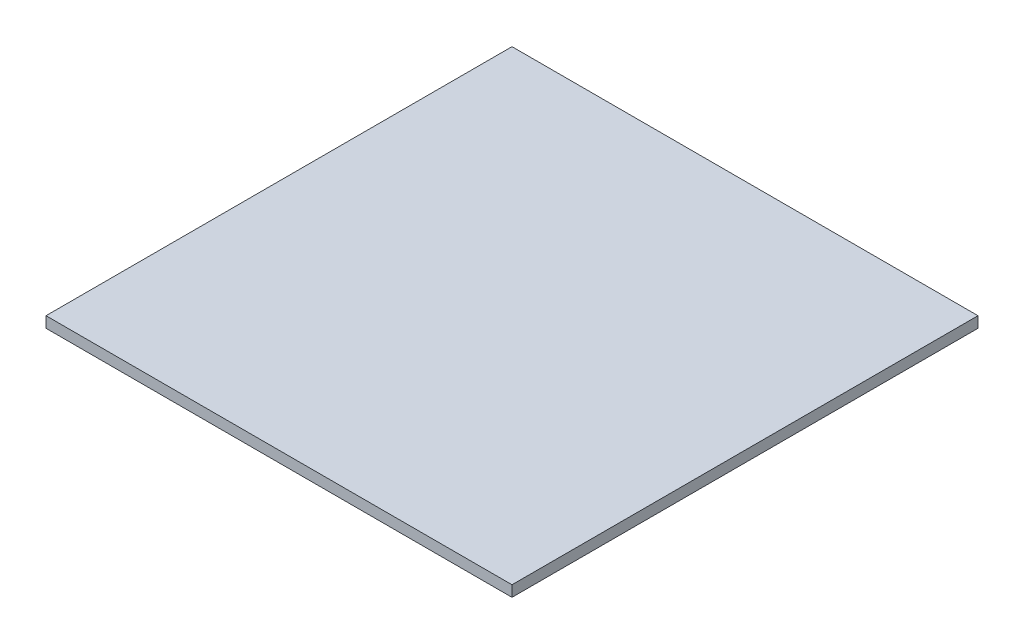
ISO-10303-21;
HEADER;
FILE_DESCRIPTION(('STEP AP214'),'2;1');
FILE_NAME('part.step','',(''),(''),'','','');
FILE_SCHEMA(('AUTOMOTIVE_DESIGN { 1 0 10303 214 1 1 1 1 }'));
ENDSEC;
DATA;
#1=APPLICATION_CONTEXT('core data for automotive mechanical design processes');
#2=APPLICATION_PROTOCOL_DEFINITION('international standard','automotive_design',2000,#1);
#3=PRODUCT_CONTEXT('',#1,'mechanical');
#4=PRODUCT('Part','Part','',(#3));
#5=PRODUCT_RELATED_PRODUCT_CATEGORY('part','',(#4));
#6=PRODUCT_DEFINITION_FORMATION('','',#4);
#7=PRODUCT_DEFINITION_CONTEXT('part definition',#1,'design');
#8=PRODUCT_DEFINITION('design','',#6,#7);
#9=PRODUCT_DEFINITION_SHAPE('','',#8);
#10=(LENGTH_UNIT() NAMED_UNIT(*) SI_UNIT(.MILLI.,.METRE.));
#11=(NAMED_UNIT(*) PLANE_ANGLE_UNIT() SI_UNIT($,.RADIAN.));
#12=(NAMED_UNIT(*) SI_UNIT($,.STERADIAN.) SOLID_ANGLE_UNIT());
#13=UNCERTAINTY_MEASURE_WITH_UNIT(LENGTH_MEASURE(1.E-05),#10,'distance_accuracy_value','');
#14=(GEOMETRIC_REPRESENTATION_CONTEXT(3) GLOBAL_UNCERTAINTY_ASSIGNED_CONTEXT((#13)) GLOBAL_UNIT_ASSIGNED_CONTEXT((#10,
#11,#12)) REPRESENTATION_CONTEXT('',''));
#15=CARTESIAN_POINT('',(0.,0.,0.));
#16=DIRECTION('',(0.,0.,1.));
#17=DIRECTION('',(1.,0.,0.));
#18=AXIS2_PLACEMENT_3D('',#15,#16,#17);
#19=CARTESIAN_POINT('',(0.,19.05,0.));
#20=DIRECTION('',(1.,0.,0.));
#21=DIRECTION('',(0.,0.,-1.));
#22=AXIS2_PLACEMENT_3D('',#19,#20,#21);
#23=PLANE('',#22);
#24=DIRECTION('',(0.,0.,1.));
#25=VECTOR('',#24,1.);
#26=CARTESIAN_POINT('',(0.,0.,0.));
#27=LINE('',#26,#25);
#28=CARTESIAN_POINT('',(0.,0.,-812.8));
#29=VERTEX_POINT('',#28);
#30=CARTESIAN_POINT('',(0.,0.,0.));
#31=VERTEX_POINT('',#30);
#32=EDGE_CURVE('E95',#29,#31,#27,.T.);
#33=ORIENTED_EDGE('',*,*,#32,.T.);
#34=DIRECTION('',(0.,-1.,0.));
#35=VECTOR('',#34,1.);
#36=CARTESIAN_POINT('',(0.,19.05,0.));
#37=LINE('',#36,#35);
#38=CARTESIAN_POINT('',(0.,19.05,0.));
#39=VERTEX_POINT('',#38);
#40=EDGE_CURVE('E11',#39,#31,#37,.T.);
#41=ORIENTED_EDGE('',*,*,#40,.F.);
#42=DIRECTION('',(0.,0.,1.));
#43=VECTOR('',#42,1.);
#44=CARTESIAN_POINT('',(0.,19.05,0.));
#45=LINE('',#44,#43);
#46=CARTESIAN_POINT('',(0.,19.05,-812.8));
#47=VERTEX_POINT('',#46);
#48=EDGE_CURVE('E83',#47,#39,#45,.T.);
#49=ORIENTED_EDGE('',*,*,#48,.F.);
#50=DIRECTION('',(0.,-1.,0.));
#51=VECTOR('',#50,1.);
#52=CARTESIAN_POINT('',(0.,19.05,-812.8));
#53=LINE('',#52,#51);
#54=EDGE_CURVE('E91',#47,#29,#53,.T.);
#55=ORIENTED_EDGE('',*,*,#54,.T.);
#56=EDGE_LOOP('',(#33,#41,#49,#55));
#57=FACE_BOUND('',#56,.T.);
#58=ADVANCED_FACE('F32',(#57),#23,.F.);
#59=CARTESIAN_POINT('',(0.,19.05,0.));
#60=DIRECTION('',(0.,0.,-1.));
#61=DIRECTION('',(-1.,0.,0.));
#62=AXIS2_PLACEMENT_3D('',#59,#60,#61);
#63=PLANE('',#62);
#64=DIRECTION('',(1.,0.,0.));
#65=VECTOR('',#64,1.);
#66=CARTESIAN_POINT('',(0.,0.,0.));
#67=LINE('',#66,#65);
#68=CARTESIAN_POINT('',(812.8,0.,0.));
#69=VERTEX_POINT('',#68);
#70=EDGE_CURVE('E87',#31,#69,#67,.T.);
#71=ORIENTED_EDGE('',*,*,#70,.T.);
#72=DIRECTION('',(0.,-1.,0.));
#73=VECTOR('',#72,1.);
#74=CARTESIAN_POINT('',(812.8,19.05,0.));
#75=LINE('',#74,#73);
#76=CARTESIAN_POINT('',(812.8,19.05,0.));
#77=VERTEX_POINT('',#76);
#78=EDGE_CURVE('E40',#77,#69,#75,.T.);
#79=ORIENTED_EDGE('',*,*,#78,.F.);
#80=DIRECTION('',(1.,0.,0.));
#81=VECTOR('',#80,1.);
#82=CARTESIAN_POINT('',(0.,19.05,0.));
#83=LINE('',#82,#81);
#84=EDGE_CURVE('E78',#39,#77,#83,.T.);
#85=ORIENTED_EDGE('',*,*,#84,.F.);
#86=ORIENTED_EDGE('',*,*,#40,.T.);
#87=EDGE_LOOP('',(#71,#79,#85,#86));
#88=FACE_BOUND('',#87,.T.);
#89=ADVANCED_FACE('F86',(#88),#63,.F.);
#90=CARTESIAN_POINT('',(812.8,19.05,0.));
#91=DIRECTION('',(-1.,0.,0.));
#92=DIRECTION('',(0.,0.,1.));
#93=AXIS2_PLACEMENT_3D('',#90,#91,#92);
#94=PLANE('',#93);
#95=DIRECTION('',(0.,0.,-1.));
#96=VECTOR('',#95,1.);
#97=CARTESIAN_POINT('',(812.8,0.,0.));
#98=LINE('',#97,#96);
#99=CARTESIAN_POINT('',(812.8,0.,-812.8));
#100=VERTEX_POINT('',#99);
#101=EDGE_CURVE('E65',#69,#100,#98,.T.);
#102=ORIENTED_EDGE('',*,*,#101,.T.);
#103=DIRECTION('',(0.,-1.,0.));
#104=VECTOR('',#103,1.);
#105=CARTESIAN_POINT('',(812.8,19.05,-812.8));
#106=LINE('',#105,#104);
#107=CARTESIAN_POINT('',(812.8,19.05,-812.8));
#108=VERTEX_POINT('',#107);
#109=EDGE_CURVE('E88',#108,#100,#106,.T.);
#110=ORIENTED_EDGE('',*,*,#109,.F.);
#111=DIRECTION('',(0.,0.,-1.));
#112=VECTOR('',#111,1.);
#113=CARTESIAN_POINT('',(812.8,19.05,0.));
#114=LINE('',#113,#112);
#115=EDGE_CURVE('E81',#77,#108,#114,.T.);
#116=ORIENTED_EDGE('',*,*,#115,.F.);
#117=ORIENTED_EDGE('',*,*,#78,.T.);
#118=EDGE_LOOP('',(#102,#110,#116,#117));
#119=FACE_BOUND('',#118,.T.);
#120=ADVANCED_FACE('F89',(#119),#94,.F.);
#121=CARTESIAN_POINT('',(0.,19.05,-812.8));
#122=DIRECTION('',(0.,0.,1.));
#123=DIRECTION('',(1.,0.,0.));
#124=AXIS2_PLACEMENT_3D('',#121,#122,#123);
#125=PLANE('',#124);
#126=DIRECTION('',(-1.,0.,0.));
#127=VECTOR('',#126,1.);
#128=CARTESIAN_POINT('',(0.,0.,-812.8));
#129=LINE('',#128,#127);
#130=EDGE_CURVE('E71',#100,#29,#129,.T.);
#131=ORIENTED_EDGE('',*,*,#130,.T.);
#132=ORIENTED_EDGE('',*,*,#54,.F.);
#133=DIRECTION('',(-1.,0.,0.));
#134=VECTOR('',#133,1.);
#135=CARTESIAN_POINT('',(0.,19.05,-812.8));
#136=LINE('',#135,#134);
#137=EDGE_CURVE('E48',#108,#47,#136,.T.);
#138=ORIENTED_EDGE('',*,*,#137,.F.);
#139=ORIENTED_EDGE('',*,*,#109,.T.);
#140=EDGE_LOOP('',(#131,#132,#138,#139));
#141=FACE_BOUND('',#140,.T.);
#142=ADVANCED_FACE('F102',(#141),#125,.F.);
#143=CARTESIAN_POINT('',(0.,19.05,-812.8));
#144=DIRECTION('',(0.,-1.,0.));
#145=DIRECTION('',(0.,0.,-1.));
#146=AXIS2_PLACEMENT_3D('',#143,#144,#145);
#147=PLANE('',#146);
#148=ORIENTED_EDGE('',*,*,#48,.T.);
#149=ORIENTED_EDGE('',*,*,#84,.T.);
#150=ORIENTED_EDGE('',*,*,#115,.T.);
#151=ORIENTED_EDGE('',*,*,#137,.T.);
#152=EDGE_LOOP('',(#148,#149,#150,#151));
#153=FACE_BOUND('',#152,.T.);
#154=ADVANCED_FACE('F79',(#153),#147,.F.);
#155=CARTESIAN_POINT('',(0.,0.,-812.8));
#156=DIRECTION('',(0.,-1.,0.));
#157=DIRECTION('',(0.,0.,-1.));
#158=AXIS2_PLACEMENT_3D('',#155,#156,#157);
#159=PLANE('',#158);
#160=ORIENTED_EDGE('',*,*,#32,.F.);
#161=ORIENTED_EDGE('',*,*,#130,.F.);
#162=ORIENTED_EDGE('',*,*,#101,.F.);
#163=ORIENTED_EDGE('',*,*,#70,.F.);
#164=EDGE_LOOP('',(#160,#161,#162,#163));
#165=FACE_BOUND('',#164,.T.);
#166=ADVANCED_FACE('F105',(#165),#159,.T.);
#167=CLOSED_SHELL('',(#58,#89,#120,#142,#154,#166));
#168=MANIFOLD_SOLID_BREP('B2',#167);
#169=ADVANCED_BREP_SHAPE_REPRESENTATION('',(#18,#168),#14);
#170=SHAPE_DEFINITION_REPRESENTATION(#9,#169);
ENDSEC;
END-ISO-10303-21;
